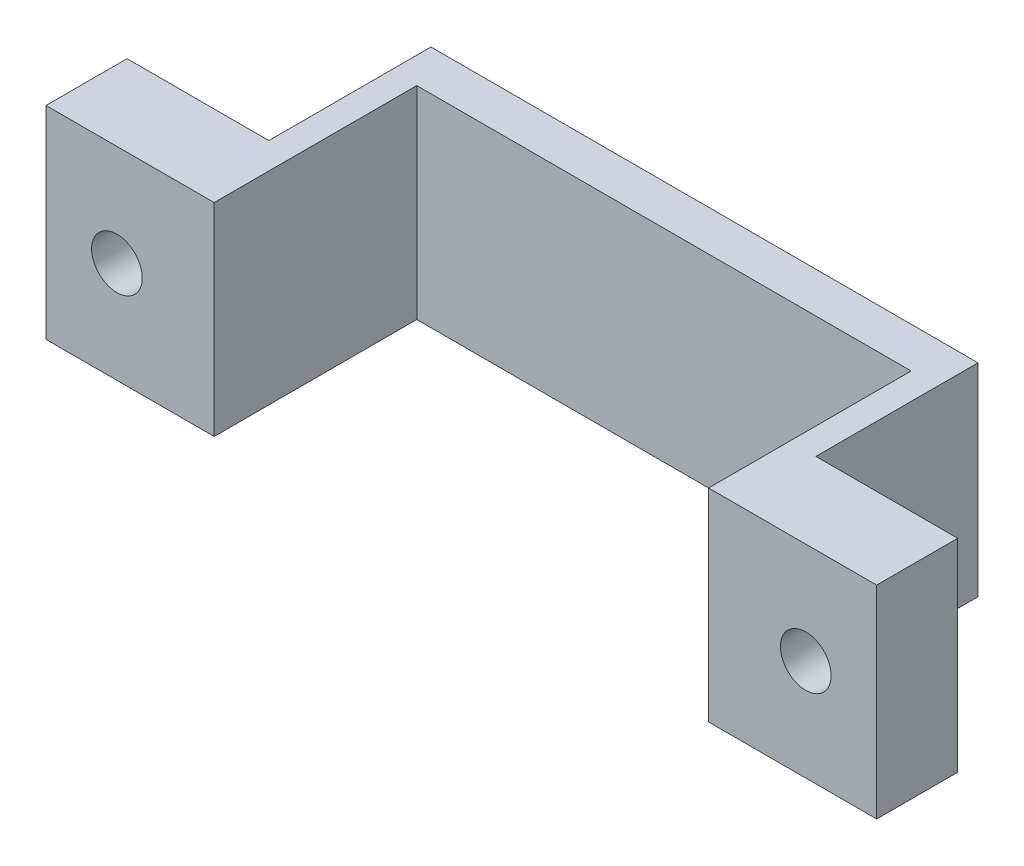
ISO-10303-21;
HEADER;
FILE_DESCRIPTION(('STEP AP214'),'2;1');
FILE_NAME('part.step','',(''),(''),'','','');
FILE_SCHEMA(('AUTOMOTIVE_DESIGN { 1 0 10303 214 1 1 1 1 }'));
ENDSEC;
DATA;
#1=APPLICATION_CONTEXT('core data for automotive mechanical design processes');
#2=APPLICATION_PROTOCOL_DEFINITION('international standard','automotive_design',2000,#1);
#3=PRODUCT_CONTEXT('',#1,'mechanical');
#4=PRODUCT('Part','Part','',(#3));
#5=PRODUCT_RELATED_PRODUCT_CATEGORY('part','',(#4));
#6=PRODUCT_DEFINITION_FORMATION('','',#4);
#7=PRODUCT_DEFINITION_CONTEXT('part definition',#1,'design');
#8=PRODUCT_DEFINITION('design','',#6,#7);
#9=PRODUCT_DEFINITION_SHAPE('','',#8);
#10=(LENGTH_UNIT() NAMED_UNIT(*) SI_UNIT(.MILLI.,.METRE.));
#11=(NAMED_UNIT(*) PLANE_ANGLE_UNIT() SI_UNIT($,.RADIAN.));
#12=(NAMED_UNIT(*) SI_UNIT($,.STERADIAN.) SOLID_ANGLE_UNIT());
#13=UNCERTAINTY_MEASURE_WITH_UNIT(LENGTH_MEASURE(1.E-05),#10,'distance_accuracy_value','');
#14=(GEOMETRIC_REPRESENTATION_CONTEXT(3) GLOBAL_UNCERTAINTY_ASSIGNED_CONTEXT((#13)) GLOBAL_UNIT_ASSIGNED_CONTEXT((#10,
#11,#12)) REPRESENTATION_CONTEXT('',''));
#15=CARTESIAN_POINT('',(0.,0.,0.));
#16=DIRECTION('',(0.,0.,1.));
#17=DIRECTION('',(1.,0.,0.));
#18=AXIS2_PLACEMENT_3D('',#15,#16,#17);
#19=CARTESIAN_POINT('',(-13.5,10.,-2.00000000000002));
#20=DIRECTION('',(1.,0.,0.));
#21=DIRECTION('',(0.,0.,-1.));
#22=AXIS2_PLACEMENT_3D('',#19,#20,#21);
#23=PLANE('',#22);
#24=DIRECTION('',(0.,0.,1.));
#25=VECTOR('',#24,1.);
#26=CARTESIAN_POINT('',(-13.5,0.,-2.00000000000002));
#27=LINE('',#26,#25);
#28=CARTESIAN_POINT('',(-13.5,0.,-2.00000000000002));
#29=VERTEX_POINT('',#28);
#30=CARTESIAN_POINT('',(-13.5,0.,5.99999999999998));
#31=VERTEX_POINT('',#30);
#32=EDGE_CURVE('E157',#29,#31,#27,.T.);
#33=ORIENTED_EDGE('',*,*,#32,.T.);
#34=DIRECTION('',(0.,-1.,0.));
#35=VECTOR('',#34,1.);
#36=CARTESIAN_POINT('',(-13.5,10.,5.99999999999998));
#37=LINE('',#36,#35);
#38=CARTESIAN_POINT('',(-13.5,10.,5.99999999999998));
#39=VERTEX_POINT('',#38);
#40=EDGE_CURVE('E11',#39,#31,#37,.T.);
#41=ORIENTED_EDGE('',*,*,#40,.F.);
#42=DIRECTION('',(0.,0.,1.));
#43=VECTOR('',#42,1.);
#44=CARTESIAN_POINT('',(-13.5,10.,-2.00000000000002));
#45=LINE('',#44,#43);
#46=CARTESIAN_POINT('',(-13.5,10.,-2.00000000000002));
#47=VERTEX_POINT('',#46);
#48=EDGE_CURVE('E180',#47,#39,#45,.T.);
#49=ORIENTED_EDGE('',*,*,#48,.F.);
#50=DIRECTION('',(0.,-1.,0.));
#51=VECTOR('',#50,1.);
#52=CARTESIAN_POINT('',(-13.5,10.,-2.00000000000002));
#53=LINE('',#52,#51);
#54=EDGE_CURVE('E153',#47,#29,#53,.T.);
#55=ORIENTED_EDGE('',*,*,#54,.T.);
#56=EDGE_LOOP('',(#33,#41,#49,#55));
#57=FACE_BOUND('',#56,.T.);
#58=ADVANCED_FACE('F37',(#57),#23,.F.);
#59=CARTESIAN_POINT('',(-13.5,10.,5.99999999999998));
#60=DIRECTION('',(0.,0.,1.));
#61=DIRECTION('',(1.,0.,0.));
#62=AXIS2_PLACEMENT_3D('',#59,#60,#61);
#63=PLANE('',#62);
#64=CARTESIAN_POINT('',(-17.,5.,5.99999999999999));
#65=DIRECTION('',(0.,0.,-1.));
#66=DIRECTION('',(-1.,0.,0.));
#67=AXIS2_PLACEMENT_3D('',#64,#65,#66);
#68=CIRCLE('',#67,1.25);
#69=CARTESIAN_POINT('',(-18.25,5.,5.99999999999999));
#70=VERTEX_POINT('',#69);
#71=EDGE_CURVE('E298',#70,#70,#68,.T.);
#72=ORIENTED_EDGE('',*,*,#71,.F.);
#73=EDGE_LOOP('',(#72));
#74=FACE_BOUND('',#73,.T.);
#75=DIRECTION('',(-1.,0.,0.));
#76=VECTOR('',#75,1.);
#77=CARTESIAN_POINT('',(-13.5,0.,5.99999999999998));
#78=LINE('',#77,#76);
#79=CARTESIAN_POINT('',(-20.5,0.,6.));
#80=VERTEX_POINT('',#79);
#81=EDGE_CURVE('E160',#31,#80,#78,.T.);
#82=ORIENTED_EDGE('',*,*,#81,.T.);
#83=DIRECTION('',(0.,-1.,0.));
#84=VECTOR('',#83,1.);
#85=CARTESIAN_POINT('',(-20.5,10.,6.));
#86=LINE('',#85,#84);
#87=CARTESIAN_POINT('',(-20.5,10.,6.));
#88=VERTEX_POINT('',#87);
#89=EDGE_CURVE('E45',#88,#80,#86,.T.);
#90=ORIENTED_EDGE('',*,*,#89,.F.);
#91=DIRECTION('',(-1.,0.,0.));
#92=VECTOR('',#91,1.);
#93=CARTESIAN_POINT('',(-13.5,10.,5.99999999999998));
#94=LINE('',#93,#92);
#95=EDGE_CURVE('E108',#39,#88,#94,.T.);
#96=ORIENTED_EDGE('',*,*,#95,.F.);
#97=ORIENTED_EDGE('',*,*,#40,.T.);
#98=EDGE_LOOP('',(#82,#90,#96,#97));
#99=FACE_BOUND('',#98,.T.);
#100=ADVANCED_FACE('F258',(#74,#99),#63,.F.);
#101=CARTESIAN_POINT('',(-20.5,10.,6.));
#102=DIRECTION('',(1.,0.,0.));
#103=DIRECTION('',(0.,0.,-1.));
#104=AXIS2_PLACEMENT_3D('',#101,#102,#103);
#105=PLANE('',#104);
#106=DIRECTION('',(0.,0.,1.));
#107=VECTOR('',#106,1.);
#108=CARTESIAN_POINT('',(-20.5,0.,6.));
#109=LINE('',#108,#107);
#110=CARTESIAN_POINT('',(-20.5,0.,10.));
#111=VERTEX_POINT('',#110);
#112=EDGE_CURVE('E163',#80,#111,#109,.T.);
#113=ORIENTED_EDGE('',*,*,#112,.T.);
#114=DIRECTION('',(0.,-1.,0.));
#115=VECTOR('',#114,1.);
#116=CARTESIAN_POINT('',(-20.5,10.,10.));
#117=LINE('',#116,#115);
#118=CARTESIAN_POINT('',(-20.5,10.,10.));
#119=VERTEX_POINT('',#118);
#120=EDGE_CURVE('E199',#119,#111,#117,.T.);
#121=ORIENTED_EDGE('',*,*,#120,.F.);
#122=DIRECTION('',(0.,0.,1.));
#123=VECTOR('',#122,1.);
#124=CARTESIAN_POINT('',(-20.5,10.,6.));
#125=LINE('',#124,#123);
#126=EDGE_CURVE('E207',#88,#119,#125,.T.);
#127=ORIENTED_EDGE('',*,*,#126,.F.);
#128=ORIENTED_EDGE('',*,*,#89,.T.);
#129=EDGE_LOOP('',(#113,#121,#127,#128));
#130=FACE_BOUND('',#129,.T.);
#131=ADVANCED_FACE('F205',(#130),#105,.F.);
#132=CARTESIAN_POINT('',(-20.5,10.,10.));
#133=DIRECTION('',(0.,0.,-1.));
#134=DIRECTION('',(-1.,0.,0.));
#135=AXIS2_PLACEMENT_3D('',#132,#133,#134);
#136=PLANE('',#135);
#137=CARTESIAN_POINT('',(-17.,5.,9.99999999999999));
#138=DIRECTION('',(0.,0.,-1.));
#139=DIRECTION('',(-1.,0.,0.));
#140=AXIS2_PLACEMENT_3D('',#137,#138,#139);
#141=CIRCLE('',#140,1.25);
#142=CARTESIAN_POINT('',(-18.25,5.,9.99999999999999));
#143=VERTEX_POINT('',#142);
#144=EDGE_CURVE('E161',#143,#143,#141,.T.);
#145=ORIENTED_EDGE('',*,*,#144,.T.);
#146=EDGE_LOOP('',(#145));
#147=FACE_BOUND('',#146,.T.);
#148=DIRECTION('',(1.,0.,0.));
#149=VECTOR('',#148,1.);
#150=CARTESIAN_POINT('',(-20.5,0.,10.));
#151=LINE('',#150,#149);
#152=CARTESIAN_POINT('',(-12.2,0.,10.));
#153=VERTEX_POINT('',#152);
#154=EDGE_CURVE('E165',#111,#153,#151,.T.);
#155=ORIENTED_EDGE('',*,*,#154,.T.);
#156=DIRECTION('',(0.,-1.,0.));
#157=VECTOR('',#156,1.);
#158=CARTESIAN_POINT('',(-12.2,10.,10.));
#159=LINE('',#158,#157);
#160=CARTESIAN_POINT('',(-12.2,10.,10.));
#161=VERTEX_POINT('',#160);
#162=EDGE_CURVE('E196',#161,#153,#159,.T.);
#163=ORIENTED_EDGE('',*,*,#162,.F.);
#164=DIRECTION('',(1.,0.,0.));
#165=VECTOR('',#164,1.);
#166=CARTESIAN_POINT('',(-20.5,10.,10.));
#167=LINE('',#166,#165);
#168=EDGE_CURVE('E225',#119,#161,#167,.T.);
#169=ORIENTED_EDGE('',*,*,#168,.F.);
#170=ORIENTED_EDGE('',*,*,#120,.T.);
#171=EDGE_LOOP('',(#155,#163,#169,#170));
#172=FACE_BOUND('',#171,.T.);
#173=ADVANCED_FACE('F216',(#147,#172),#136,.F.);
#174=CARTESIAN_POINT('',(-12.2,10.,10.));
#175=DIRECTION('',(-1.,0.,0.));
#176=DIRECTION('',(0.,0.,1.));
#177=AXIS2_PLACEMENT_3D('',#174,#175,#176);
#178=PLANE('',#177);
#179=DIRECTION('',(0.,0.,-1.));
#180=VECTOR('',#179,1.);
#181=CARTESIAN_POINT('',(-12.2,0.,10.));
#182=LINE('',#181,#180);
#183=CARTESIAN_POINT('',(-12.2,0.,0.));
#184=VERTEX_POINT('',#183);
#185=EDGE_CURVE('E167',#153,#184,#182,.T.);
#186=ORIENTED_EDGE('',*,*,#185,.T.);
#187=DIRECTION('',(0.,-1.,0.));
#188=VECTOR('',#187,1.);
#189=CARTESIAN_POINT('',(-12.2,10.,0.));
#190=LINE('',#189,#188);
#191=CARTESIAN_POINT('',(-12.2,10.,0.));
#192=VERTEX_POINT('',#191);
#193=EDGE_CURVE('E193',#192,#184,#190,.T.);
#194=ORIENTED_EDGE('',*,*,#193,.F.);
#195=DIRECTION('',(0.,0.,-1.));
#196=VECTOR('',#195,1.);
#197=CARTESIAN_POINT('',(-12.2,10.,10.));
#198=LINE('',#197,#196);
#199=EDGE_CURVE('E222',#161,#192,#198,.T.);
#200=ORIENTED_EDGE('',*,*,#199,.F.);
#201=ORIENTED_EDGE('',*,*,#162,.T.);
#202=EDGE_LOOP('',(#186,#194,#200,#201));
#203=FACE_BOUND('',#202,.T.);
#204=ADVANCED_FACE('F220',(#203),#178,.F.);
#205=CARTESIAN_POINT('',(-12.2,10.,0.));
#206=DIRECTION('',(0.,0.,-1.));
#207=DIRECTION('',(-1.,0.,0.));
#208=AXIS2_PLACEMENT_3D('',#205,#206,#207);
#209=PLANE('',#208);
#210=DIRECTION('',(1.,0.,0.));
#211=VECTOR('',#210,1.);
#212=CARTESIAN_POINT('',(-12.2,0.,0.));
#213=LINE('',#212,#211);
#214=CARTESIAN_POINT('',(12.2,0.,0.));
#215=VERTEX_POINT('',#214);
#216=EDGE_CURVE('E169',#184,#215,#213,.T.);
#217=ORIENTED_EDGE('',*,*,#216,.T.);
#218=DIRECTION('',(0.,-1.,0.));
#219=VECTOR('',#218,1.);
#220=CARTESIAN_POINT('',(12.2,10.,0.));
#221=LINE('',#220,#219);
#222=CARTESIAN_POINT('',(12.2,10.,0.));
#223=VERTEX_POINT('',#222);
#224=EDGE_CURVE('E190',#223,#215,#221,.T.);
#225=ORIENTED_EDGE('',*,*,#224,.F.);
#226=DIRECTION('',(1.,0.,0.));
#227=VECTOR('',#226,1.);
#228=CARTESIAN_POINT('',(-12.2,10.,0.));
#229=LINE('',#228,#227);
#230=EDGE_CURVE('E224',#192,#223,#229,.T.);
#231=ORIENTED_EDGE('',*,*,#230,.F.);
#232=ORIENTED_EDGE('',*,*,#193,.T.);
#233=EDGE_LOOP('',(#217,#225,#231,#232));
#234=FACE_BOUND('',#233,.T.);
#235=ADVANCED_FACE('F274',(#234),#209,.F.);
#236=CARTESIAN_POINT('',(12.2,10.,9.99999999999992));
#237=DIRECTION('',(1.,0.,0.));
#238=DIRECTION('',(0.,0.,-1.));
#239=AXIS2_PLACEMENT_3D('',#236,#237,#238);
#240=PLANE('',#239);
#241=DIRECTION('',(0.,0.,1.));
#242=VECTOR('',#241,1.);
#243=CARTESIAN_POINT('',(12.2,0.,9.99999999999992));
#244=LINE('',#243,#242);
#245=CARTESIAN_POINT('',(12.2,0.,9.99999999999992));
#246=VERTEX_POINT('',#245);
#247=EDGE_CURVE('E171',#215,#246,#244,.T.);
#248=ORIENTED_EDGE('',*,*,#247,.T.);
#249=DIRECTION('',(0.,-1.,0.));
#250=VECTOR('',#249,1.);
#251=CARTESIAN_POINT('',(12.2,10.,9.99999999999992));
#252=LINE('',#251,#250);
#253=CARTESIAN_POINT('',(12.2,10.,9.99999999999992));
#254=VERTEX_POINT('',#253);
#255=EDGE_CURVE('E187',#254,#246,#252,.T.);
#256=ORIENTED_EDGE('',*,*,#255,.F.);
#257=DIRECTION('',(0.,0.,1.));
#258=VECTOR('',#257,1.);
#259=CARTESIAN_POINT('',(12.2,10.,9.99999999999992));
#260=LINE('',#259,#258);
#261=EDGE_CURVE('E227',#223,#254,#260,.T.);
#262=ORIENTED_EDGE('',*,*,#261,.F.);
#263=ORIENTED_EDGE('',*,*,#224,.T.);
#264=EDGE_LOOP('',(#248,#256,#262,#263));
#265=FACE_BOUND('',#264,.T.);
#266=ADVANCED_FACE('F277',(#265),#240,.F.);
#267=CARTESIAN_POINT('',(20.5,10.,9.99999999999991));
#268=DIRECTION('',(0.,0.,-1.));
#269=DIRECTION('',(-1.,0.,0.));
#270=AXIS2_PLACEMENT_3D('',#267,#268,#269);
#271=PLANE('',#270);
#272=CARTESIAN_POINT('',(17.,5.,9.99999999999999));
#273=DIRECTION('',(0.,0.,1.));
#274=DIRECTION('',(1.,0.,0.));
#275=AXIS2_PLACEMENT_3D('',#272,#273,#274);
#276=CIRCLE('',#275,1.25);
#277=CARTESIAN_POINT('',(18.25,5.,9.99999999999999));
#278=VERTEX_POINT('',#277);
#279=EDGE_CURVE('E295',#278,#278,#276,.T.);
#280=ORIENTED_EDGE('',*,*,#279,.F.);
#281=EDGE_LOOP('',(#280));
#282=FACE_BOUND('',#281,.T.);
#283=DIRECTION('',(1.,0.,0.));
#284=VECTOR('',#283,1.);
#285=CARTESIAN_POINT('',(20.5,0.,9.99999999999991));
#286=LINE('',#285,#284);
#287=CARTESIAN_POINT('',(20.5,0.,9.99999999999991));
#288=VERTEX_POINT('',#287);
#289=EDGE_CURVE('E173',#246,#288,#286,.T.);
#290=ORIENTED_EDGE('',*,*,#289,.T.);
#291=DIRECTION('',(0.,-1.,0.));
#292=VECTOR('',#291,1.);
#293=CARTESIAN_POINT('',(20.5,10.,9.99999999999991));
#294=LINE('',#293,#292);
#295=CARTESIAN_POINT('',(20.5,10.,9.99999999999991));
#296=VERTEX_POINT('',#295);
#297=EDGE_CURVE('E184',#296,#288,#294,.T.);
#298=ORIENTED_EDGE('',*,*,#297,.F.);
#299=DIRECTION('',(1.,0.,0.));
#300=VECTOR('',#299,1.);
#301=CARTESIAN_POINT('',(20.5,10.,9.99999999999991));
#302=LINE('',#301,#300);
#303=EDGE_CURVE('E233',#254,#296,#302,.T.);
#304=ORIENTED_EDGE('',*,*,#303,.F.);
#305=ORIENTED_EDGE('',*,*,#255,.T.);
#306=EDGE_LOOP('',(#290,#298,#304,#305));
#307=FACE_BOUND('',#306,.T.);
#308=ADVANCED_FACE('F239',(#282,#307),#271,.F.);
#309=CARTESIAN_POINT('',(20.5,10.,5.99999999999991));
#310=DIRECTION('',(-1.,0.,0.));
#311=DIRECTION('',(0.,0.,1.));
#312=AXIS2_PLACEMENT_3D('',#309,#310,#311);
#313=PLANE('',#312);
#314=DIRECTION('',(0.,0.,-1.));
#315=VECTOR('',#314,1.);
#316=CARTESIAN_POINT('',(20.5,0.,5.99999999999991));
#317=LINE('',#316,#315);
#318=CARTESIAN_POINT('',(20.5,0.,5.99999999999991));
#319=VERTEX_POINT('',#318);
#320=EDGE_CURVE('E175',#288,#319,#317,.T.);
#321=ORIENTED_EDGE('',*,*,#320,.T.);
#322=DIRECTION('',(0.,-1.,0.));
#323=VECTOR('',#322,1.);
#324=CARTESIAN_POINT('',(20.5,10.,5.99999999999991));
#325=LINE('',#324,#323);
#326=CARTESIAN_POINT('',(20.5,10.,5.99999999999991));
#327=VERTEX_POINT('',#326);
#328=EDGE_CURVE('E148',#327,#319,#325,.T.);
#329=ORIENTED_EDGE('',*,*,#328,.F.);
#330=DIRECTION('',(0.,0.,-1.));
#331=VECTOR('',#330,1.);
#332=CARTESIAN_POINT('',(20.5,10.,5.99999999999991));
#333=LINE('',#332,#331);
#334=EDGE_CURVE('E139',#296,#327,#333,.T.);
#335=ORIENTED_EDGE('',*,*,#334,.F.);
#336=ORIENTED_EDGE('',*,*,#297,.T.);
#337=EDGE_LOOP('',(#321,#329,#335,#336));
#338=FACE_BOUND('',#337,.T.);
#339=ADVANCED_FACE('F243',(#338),#313,.F.);
#340=CARTESIAN_POINT('',(13.5,10.,5.99999999999993));
#341=DIRECTION('',(0.,0.,1.));
#342=DIRECTION('',(1.,0.,0.));
#343=AXIS2_PLACEMENT_3D('',#340,#341,#342);
#344=PLANE('',#343);
#345=CARTESIAN_POINT('',(17.,5.,5.99999999999999));
#346=DIRECTION('',(0.,0.,1.));
#347=DIRECTION('',(1.,0.,0.));
#348=AXIS2_PLACEMENT_3D('',#345,#346,#347);
#349=CIRCLE('',#348,1.25);
#350=CARTESIAN_POINT('',(18.25,5.,5.99999999999999));
#351=VERTEX_POINT('',#350);
#352=EDGE_CURVE('E293',#351,#351,#349,.T.);
#353=ORIENTED_EDGE('',*,*,#352,.T.);
#354=EDGE_LOOP('',(#353));
#355=FACE_BOUND('',#354,.T.);
#356=DIRECTION('',(-1.,0.,0.));
#357=VECTOR('',#356,1.);
#358=CARTESIAN_POINT('',(13.5,0.,5.99999999999993));
#359=LINE('',#358,#357);
#360=CARTESIAN_POINT('',(13.5,0.,5.99999999999993));
#361=VERTEX_POINT('',#360);
#362=EDGE_CURVE('E147',#319,#361,#359,.T.);
#363=ORIENTED_EDGE('',*,*,#362,.T.);
#364=DIRECTION('',(0.,-1.,0.));
#365=VECTOR('',#364,1.);
#366=CARTESIAN_POINT('',(13.5,10.,5.99999999999993));
#367=LINE('',#366,#365);
#368=CARTESIAN_POINT('',(13.5,10.,5.99999999999993));
#369=VERTEX_POINT('',#368);
#370=EDGE_CURVE('E144',#369,#361,#367,.T.);
#371=ORIENTED_EDGE('',*,*,#370,.F.);
#372=DIRECTION('',(-1.,0.,0.));
#373=VECTOR('',#372,1.);
#374=CARTESIAN_POINT('',(13.5,10.,5.99999999999993));
#375=LINE('',#374,#373);
#376=EDGE_CURVE('E133',#327,#369,#375,.T.);
#377=ORIENTED_EDGE('',*,*,#376,.F.);
#378=ORIENTED_EDGE('',*,*,#328,.T.);
#379=EDGE_LOOP('',(#363,#371,#377,#378));
#380=FACE_BOUND('',#379,.T.);
#381=ADVANCED_FACE('F145',(#355,#380),#344,.F.);
#382=CARTESIAN_POINT('',(13.5,10.,-2.00000000000007));
#383=DIRECTION('',(-1.,0.,0.));
#384=DIRECTION('',(0.,0.,1.));
#385=AXIS2_PLACEMENT_3D('',#382,#383,#384);
#386=PLANE('',#385);
#387=DIRECTION('',(0.,0.,-1.));
#388=VECTOR('',#387,1.);
#389=CARTESIAN_POINT('',(13.5,0.,-2.00000000000007));
#390=LINE('',#389,#388);
#391=CARTESIAN_POINT('',(13.5,0.,-2.00000000000007));
#392=VERTEX_POINT('',#391);
#393=EDGE_CURVE('E94',#361,#392,#390,.T.);
#394=ORIENTED_EDGE('',*,*,#393,.T.);
#395=DIRECTION('',(0.,-1.,0.));
#396=VECTOR('',#395,1.);
#397=CARTESIAN_POINT('',(13.5,10.,-2.00000000000007));
#398=LINE('',#397,#396);
#399=CARTESIAN_POINT('',(13.5,10.,-2.00000000000007));
#400=VERTEX_POINT('',#399);
#401=EDGE_CURVE('E149',#400,#392,#398,.T.);
#402=ORIENTED_EDGE('',*,*,#401,.F.);
#403=DIRECTION('',(0.,0.,-1.));
#404=VECTOR('',#403,1.);
#405=CARTESIAN_POINT('',(13.5,10.,-2.00000000000007));
#406=LINE('',#405,#404);
#407=EDGE_CURVE('E137',#369,#400,#406,.T.);
#408=ORIENTED_EDGE('',*,*,#407,.F.);
#409=ORIENTED_EDGE('',*,*,#370,.T.);
#410=EDGE_LOOP('',(#394,#402,#408,#409));
#411=FACE_BOUND('',#410,.T.);
#412=ADVANCED_FACE('F151',(#411),#386,.F.);
#413=CARTESIAN_POINT('',(-13.5,10.,-2.00000000000002));
#414=DIRECTION('',(0.,0.,1.));
#415=DIRECTION('',(1.,0.,0.));
#416=AXIS2_PLACEMENT_3D('',#413,#414,#415);
#417=PLANE('',#416);
#418=DIRECTION('',(-1.,0.,0.));
#419=VECTOR('',#418,1.);
#420=CARTESIAN_POINT('',(-13.5,0.,-2.00000000000002));
#421=LINE('',#420,#419);
#422=EDGE_CURVE('E100',#392,#29,#421,.T.);
#423=ORIENTED_EDGE('',*,*,#422,.T.);
#424=ORIENTED_EDGE('',*,*,#54,.F.);
#425=DIRECTION('',(-1.,0.,0.));
#426=VECTOR('',#425,1.);
#427=CARTESIAN_POINT('',(-13.5,10.,-2.00000000000002));
#428=LINE('',#427,#426);
#429=EDGE_CURVE('E53',#400,#47,#428,.T.);
#430=ORIENTED_EDGE('',*,*,#429,.F.);
#431=ORIENTED_EDGE('',*,*,#401,.T.);
#432=EDGE_LOOP('',(#423,#424,#430,#431));
#433=FACE_BOUND('',#432,.T.);
#434=ADVANCED_FACE('F247',(#433),#417,.F.);
#435=CARTESIAN_POINT('',(0.,10.,0.));
#436=DIRECTION('',(0.,-1.,0.));
#437=DIRECTION('',(0.,0.,-1.));
#438=AXIS2_PLACEMENT_3D('',#435,#436,#437);
#439=PLANE('',#438);
#440=ORIENTED_EDGE('',*,*,#48,.T.);
#441=ORIENTED_EDGE('',*,*,#95,.T.);
#442=ORIENTED_EDGE('',*,*,#126,.T.);
#443=ORIENTED_EDGE('',*,*,#168,.T.);
#444=ORIENTED_EDGE('',*,*,#199,.T.);
#445=ORIENTED_EDGE('',*,*,#230,.T.);
#446=ORIENTED_EDGE('',*,*,#261,.T.);
#447=ORIENTED_EDGE('',*,*,#303,.T.);
#448=ORIENTED_EDGE('',*,*,#334,.T.);
#449=ORIENTED_EDGE('',*,*,#376,.T.);
#450=ORIENTED_EDGE('',*,*,#407,.T.);
#451=ORIENTED_EDGE('',*,*,#429,.T.);
#452=EDGE_LOOP('',(#440,#441,#442,#443,#444,#445,#446,#447,#448,#449,#450,#451));
#453=FACE_BOUND('',#452,.T.);
#454=ADVANCED_FACE('F135',(#453),#439,.F.);
#455=CARTESIAN_POINT('',(0.,0.,0.));
#456=DIRECTION('',(0.,-1.,0.));
#457=DIRECTION('',(0.,0.,-1.));
#458=AXIS2_PLACEMENT_3D('',#455,#456,#457);
#459=PLANE('',#458);
#460=ORIENTED_EDGE('',*,*,#32,.F.);
#461=ORIENTED_EDGE('',*,*,#422,.F.);
#462=ORIENTED_EDGE('',*,*,#393,.F.);
#463=ORIENTED_EDGE('',*,*,#362,.F.);
#464=ORIENTED_EDGE('',*,*,#320,.F.);
#465=ORIENTED_EDGE('',*,*,#289,.F.);
#466=ORIENTED_EDGE('',*,*,#247,.F.);
#467=ORIENTED_EDGE('',*,*,#216,.F.);
#468=ORIENTED_EDGE('',*,*,#185,.F.);
#469=ORIENTED_EDGE('',*,*,#154,.F.);
#470=ORIENTED_EDGE('',*,*,#112,.F.);
#471=ORIENTED_EDGE('',*,*,#81,.F.);
#472=EDGE_LOOP('',(#460,#461,#462,#463,#464,#465,#466,#467,#468,#469,#470,#471));
#473=FACE_BOUND('',#472,.T.);
#474=ADVANCED_FACE('F211',(#473),#459,.T.);
#475=CARTESIAN_POINT('',(-17.,5.,9.99999999999999));
#476=DIRECTION('',(0.,0.,-1.));
#477=DIRECTION('',(-1.,0.,0.));
#478=AXIS2_PLACEMENT_3D('',#475,#476,#477);
#479=CYLINDRICAL_SURFACE('',#478,1.25);
#480=ORIENTED_EDGE('',*,*,#144,.F.);
#481=EDGE_LOOP('',(#480));
#482=FACE_BOUND('',#481,.T.);
#483=ORIENTED_EDGE('',*,*,#71,.T.);
#484=EDGE_LOOP('',(#483));
#485=FACE_BOUND('',#484,.T.);
#486=ADVANCED_FACE('F307',(#482,#485),#479,.F.);
#487=CARTESIAN_POINT('',(17.,5.,9.99999999999999));
#488=DIRECTION('',(0.,0.,-1.));
#489=DIRECTION('',(-1.,0.,0.));
#490=AXIS2_PLACEMENT_3D('',#487,#488,#489);
#491=CYLINDRICAL_SURFACE('',#490,1.25);
#492=ORIENTED_EDGE('',*,*,#279,.T.);
#493=EDGE_LOOP('',(#492));
#494=FACE_BOUND('',#493,.T.);
#495=ORIENTED_EDGE('',*,*,#352,.F.);
#496=EDGE_LOOP('',(#495));
#497=FACE_BOUND('',#496,.T.);
#498=ADVANCED_FACE('F309',(#494,#497),#491,.F.);
#499=CLOSED_SHELL('',(#58,#100,#131,#173,#204,#235,#266,#308,#339,#381,#412,#434,#454,#474,#486,#498));
#500=MANIFOLD_SOLID_BREP('B2',#499);
#501=ADVANCED_BREP_SHAPE_REPRESENTATION('',(#18,#500),#14);
#502=SHAPE_DEFINITION_REPRESENTATION(#9,#501);
ENDSEC;
END-ISO-10303-21;
